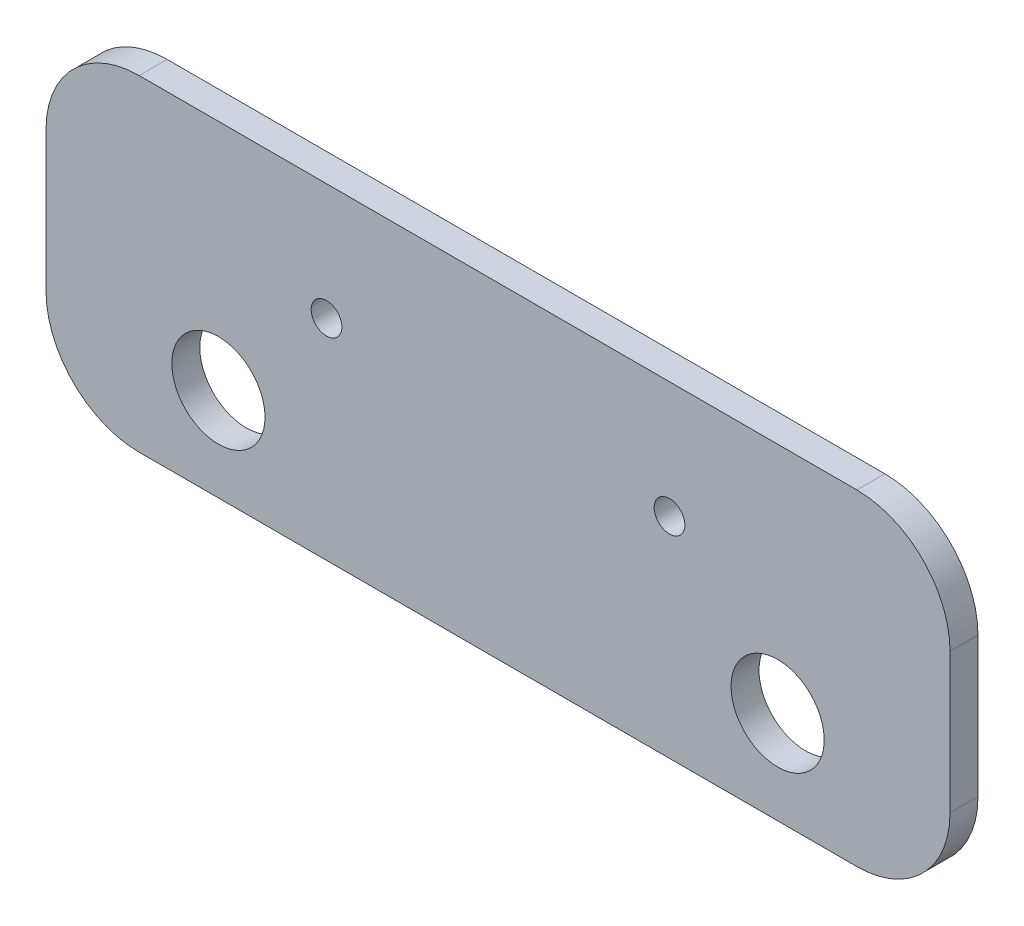
ISO-10303-21;
HEADER;
FILE_DESCRIPTION(('STEP AP214'),'2;1');
FILE_NAME('part.step','',(''),(''),'','','');
FILE_SCHEMA(('AUTOMOTIVE_DESIGN { 1 0 10303 214 1 1 1 1 }'));
ENDSEC;
DATA;
#1=APPLICATION_CONTEXT('core data for automotive mechanical design processes');
#2=APPLICATION_PROTOCOL_DEFINITION('international standard','automotive_design',2000,#1);
#3=PRODUCT_CONTEXT('',#1,'mechanical');
#4=PRODUCT('Part','Part','',(#3));
#5=PRODUCT_RELATED_PRODUCT_CATEGORY('part','',(#4));
#6=PRODUCT_DEFINITION_FORMATION('','',#4);
#7=PRODUCT_DEFINITION_CONTEXT('part definition',#1,'design');
#8=PRODUCT_DEFINITION('design','',#6,#7);
#9=PRODUCT_DEFINITION_SHAPE('','',#8);
#10=(LENGTH_UNIT() NAMED_UNIT(*) SI_UNIT(.MILLI.,.METRE.));
#11=(NAMED_UNIT(*) PLANE_ANGLE_UNIT() SI_UNIT($,.RADIAN.));
#12=(NAMED_UNIT(*) SI_UNIT($,.STERADIAN.) SOLID_ANGLE_UNIT());
#13=UNCERTAINTY_MEASURE_WITH_UNIT(LENGTH_MEASURE(1.E-05),#10,'distance_accuracy_value','');
#14=(GEOMETRIC_REPRESENTATION_CONTEXT(3) GLOBAL_UNCERTAINTY_ASSIGNED_CONTEXT((#13)) GLOBAL_UNIT_ASSIGNED_CONTEXT((#10,
#11,#12)) REPRESENTATION_CONTEXT('',''));
#15=CARTESIAN_POINT('',(0.,0.,0.));
#16=DIRECTION('',(0.,0.,1.));
#17=DIRECTION('',(1.,0.,0.));
#18=AXIS2_PLACEMENT_3D('',#15,#16,#17);
#19=CARTESIAN_POINT('',(0.,0.,3.));
#20=DIRECTION('',(0.,0.,-1.));
#21=DIRECTION('',(-1.,0.,0.));
#22=AXIS2_PLACEMENT_3D('',#19,#20,#21);
#23=PLANE('',#22);
#24=CARTESIAN_POINT('',(-30.,-7.5,3.));
#25=DIRECTION('',(0.,0.,1.));
#26=DIRECTION('',(1.,0.,0.));
#27=AXIS2_PLACEMENT_3D('',#24,#25,#26);
#28=CIRCLE('',#27,5.);
#29=CARTESIAN_POINT('',(-25.,-7.5,3.));
#30=VERTEX_POINT('',#29);
#31=EDGE_CURVE('E193',#30,#30,#28,.T.);
#32=ORIENTED_EDGE('',*,*,#31,.F.);
#33=EDGE_LOOP('',(#32));
#34=FACE_BOUND('',#33,.T.);
#35=CARTESIAN_POINT('',(30.,-7.50000000000005,3.));
#36=DIRECTION('',(0.,0.,-1.));
#37=DIRECTION('',(-1.,0.,0.));
#38=AXIS2_PLACEMENT_3D('',#35,#36,#37);
#39=CIRCLE('',#38,5.);
#40=CARTESIAN_POINT('',(25.,-7.50000000000005,3.));
#41=VERTEX_POINT('',#40);
#42=EDGE_CURVE('E183',#41,#41,#39,.T.);
#43=ORIENTED_EDGE('',*,*,#42,.T.);
#44=EDGE_LOOP('',(#43));
#45=FACE_BOUND('',#44,.T.);
#46=DIRECTION('',(0.,-1.,0.));
#47=VECTOR('',#46,1.);
#48=CARTESIAN_POINT('',(48.5,-17.5,3.));
#49=LINE('',#48,#47);
#50=CARTESIAN_POINT('',(48.5,7.5,3.));
#51=VERTEX_POINT('',#50);
#52=CARTESIAN_POINT('',(48.5,-7.5,3.));
#53=VERTEX_POINT('',#52);
#54=EDGE_CURVE('E210',#51,#53,#49,.T.);
#55=ORIENTED_EDGE('',*,*,#54,.F.);
#56=CARTESIAN_POINT('',(38.5,7.5,3.));
#57=DIRECTION('',(0.,0.,-1.));
#58=DIRECTION('',(-1.,0.,0.));
#59=AXIS2_PLACEMENT_3D('',#56,#57,#58);
#60=CIRCLE('',#59,10.);
#61=CARTESIAN_POINT('',(38.5,17.5,3.));
#62=VERTEX_POINT('',#61);
#63=EDGE_CURVE('E136',#51,#62,#60,.F.);
#64=ORIENTED_EDGE('',*,*,#63,.T.);
#65=DIRECTION('',(-1.,0.,0.));
#66=VECTOR('',#65,1.);
#67=CARTESIAN_POINT('',(-45.5,17.5,3.));
#68=LINE('',#67,#66);
#69=CARTESIAN_POINT('',(-38.5,17.5,3.));
#70=VERTEX_POINT('',#69);
#71=EDGE_CURVE('E214',#62,#70,#68,.T.);
#72=ORIENTED_EDGE('',*,*,#71,.T.);
#73=CARTESIAN_POINT('',(-38.5,7.5,3.));
#74=DIRECTION('',(0.,0.,-1.));
#75=DIRECTION('',(-1.,0.,0.));
#76=AXIS2_PLACEMENT_3D('',#73,#74,#75);
#77=CIRCLE('',#76,10.);
#78=CARTESIAN_POINT('',(-48.5,7.5,3.));
#79=VERTEX_POINT('',#78);
#80=EDGE_CURVE('E142',#70,#79,#77,.F.);
#81=ORIENTED_EDGE('',*,*,#80,.T.);
#82=DIRECTION('',(0.,1.,0.));
#83=VECTOR('',#82,1.);
#84=CARTESIAN_POINT('',(-48.5,17.5,3.));
#85=LINE('',#84,#83);
#86=CARTESIAN_POINT('',(-48.5,-7.5,3.));
#87=VERTEX_POINT('',#86);
#88=EDGE_CURVE('E133',#87,#79,#85,.T.);
#89=ORIENTED_EDGE('',*,*,#88,.F.);
#90=CARTESIAN_POINT('',(-38.5,-7.5,3.));
#91=DIRECTION('',(0.,0.,-1.));
#92=DIRECTION('',(-1.,0.,0.));
#93=AXIS2_PLACEMENT_3D('',#90,#91,#92);
#94=CIRCLE('',#93,10.);
#95=CARTESIAN_POINT('',(-38.5,-17.5,3.));
#96=VERTEX_POINT('',#95);
#97=EDGE_CURVE('E138',#87,#96,#94,.F.);
#98=ORIENTED_EDGE('',*,*,#97,.T.);
#99=DIRECTION('',(1.,0.,0.));
#100=VECTOR('',#99,1.);
#101=CARTESIAN_POINT('',(-45.5,-17.5,3.));
#102=LINE('',#101,#100);
#103=CARTESIAN_POINT('',(38.5,-17.5,3.));
#104=VERTEX_POINT('',#103);
#105=EDGE_CURVE('E144',#96,#104,#102,.T.);
#106=ORIENTED_EDGE('',*,*,#105,.T.);
#107=CARTESIAN_POINT('',(38.5,-7.5,3.));
#108=DIRECTION('',(0.,0.,-1.));
#109=DIRECTION('',(-1.,0.,0.));
#110=AXIS2_PLACEMENT_3D('',#107,#108,#109);
#111=CIRCLE('',#110,10.);
#112=EDGE_CURVE('E150',#104,#53,#111,.F.);
#113=ORIENTED_EDGE('',*,*,#112,.T.);
#114=EDGE_LOOP('',(#55,#64,#72,#81,#89,#98,#106,#113));
#115=FACE_BOUND('',#114,.T.);
#116=CARTESIAN_POINT('',(-18.4,5.00000000000009,3.));
#117=DIRECTION('',(0.,0.,-1.));
#118=DIRECTION('',(-1.,0.,0.));
#119=AXIS2_PLACEMENT_3D('',#116,#117,#118);
#120=CIRCLE('',#119,1.65);
#121=CARTESIAN_POINT('',(-20.05,5.00000000000009,3.));
#122=VERTEX_POINT('',#121);
#123=EDGE_CURVE('E185',#122,#122,#120,.T.);
#124=ORIENTED_EDGE('',*,*,#123,.T.);
#125=EDGE_LOOP('',(#124));
#126=FACE_BOUND('',#125,.T.);
#127=CARTESIAN_POINT('',(18.4,5.00000000000008,3.));
#128=DIRECTION('',(0.,0.,1.));
#129=DIRECTION('',(1.,0.,0.));
#130=AXIS2_PLACEMENT_3D('',#127,#128,#129);
#131=CIRCLE('',#130,1.65);
#132=CARTESIAN_POINT('',(20.05,5.00000000000008,3.));
#133=VERTEX_POINT('',#132);
#134=EDGE_CURVE('E177',#133,#133,#131,.T.);
#135=ORIENTED_EDGE('',*,*,#134,.F.);
#136=EDGE_LOOP('',(#135));
#137=FACE_BOUND('',#136,.T.);
#138=ADVANCED_FACE('F39',(#34,#45,#115,#126,#137),#23,.F.);
#139=CARTESIAN_POINT('',(0.,0.,0.));
#140=DIRECTION('',(0.,0.,-1.));
#141=DIRECTION('',(-1.,0.,0.));
#142=AXIS2_PLACEMENT_3D('',#139,#140,#141);
#143=PLANE('',#142);
#144=CARTESIAN_POINT('',(-18.4,5.00000000000009,0.));
#145=DIRECTION('',(0.,0.,-1.));
#146=DIRECTION('',(-1.,0.,0.));
#147=AXIS2_PLACEMENT_3D('',#144,#145,#146);
#148=CIRCLE('',#147,1.65);
#149=CARTESIAN_POINT('',(-20.05,5.00000000000009,0.));
#150=VERTEX_POINT('',#149);
#151=EDGE_CURVE('E174',#150,#150,#148,.F.);
#152=ORIENTED_EDGE('',*,*,#151,.T.);
#153=EDGE_LOOP('',(#152));
#154=FACE_BOUND('',#153,.T.);
#155=CARTESIAN_POINT('',(30.,-7.50000000000005,0.));
#156=DIRECTION('',(0.,0.,-1.));
#157=DIRECTION('',(-1.,0.,0.));
#158=AXIS2_PLACEMENT_3D('',#155,#156,#157);
#159=CIRCLE('',#158,5.);
#160=CARTESIAN_POINT('',(25.,-7.50000000000005,0.));
#161=VERTEX_POINT('',#160);
#162=EDGE_CURVE('E197',#161,#161,#159,.F.);
#163=ORIENTED_EDGE('',*,*,#162,.T.);
#164=EDGE_LOOP('',(#163));
#165=FACE_BOUND('',#164,.T.);
#166=DIRECTION('',(1.,0.,0.));
#167=VECTOR('',#166,1.);
#168=CARTESIAN_POINT('',(-45.5,17.5,0.));
#169=LINE('',#168,#167);
#170=CARTESIAN_POINT('',(-38.5,17.5,0.));
#171=VERTEX_POINT('',#170);
#172=CARTESIAN_POINT('',(38.5,17.5,0.));
#173=VERTEX_POINT('',#172);
#174=EDGE_CURVE('E115',#171,#173,#169,.T.);
#175=ORIENTED_EDGE('',*,*,#174,.T.);
#176=CARTESIAN_POINT('',(38.5,7.5,0.));
#177=DIRECTION('',(0.,0.,-1.));
#178=DIRECTION('',(-1.,0.,0.));
#179=AXIS2_PLACEMENT_3D('',#176,#177,#178);
#180=CIRCLE('',#179,10.);
#181=CARTESIAN_POINT('',(48.5,7.5,0.));
#182=VERTEX_POINT('',#181);
#183=EDGE_CURVE('E109',#173,#182,#180,.T.);
#184=ORIENTED_EDGE('',*,*,#183,.T.);
#185=DIRECTION('',(0.,-1.,0.));
#186=VECTOR('',#185,1.);
#187=CARTESIAN_POINT('',(48.5,0.,0.));
#188=LINE('',#187,#186);
#189=CARTESIAN_POINT('',(48.5,-7.5,0.));
#190=VERTEX_POINT('',#189);
#191=EDGE_CURVE('E113',#182,#190,#188,.T.);
#192=ORIENTED_EDGE('',*,*,#191,.T.);
#193=CARTESIAN_POINT('',(38.5,-7.5,0.));
#194=DIRECTION('',(0.,0.,-1.));
#195=DIRECTION('',(-1.,0.,0.));
#196=AXIS2_PLACEMENT_3D('',#193,#194,#195);
#197=CIRCLE('',#196,10.);
#198=CARTESIAN_POINT('',(38.5,-17.5,0.));
#199=VERTEX_POINT('',#198);
#200=EDGE_CURVE('E121',#190,#199,#197,.T.);
#201=ORIENTED_EDGE('',*,*,#200,.T.);
#202=DIRECTION('',(1.,0.,0.));
#203=VECTOR('',#202,1.);
#204=CARTESIAN_POINT('',(-45.5,-17.5,0.));
#205=LINE('',#204,#203);
#206=CARTESIAN_POINT('',(-38.5,-17.5,0.));
#207=VERTEX_POINT('',#206);
#208=EDGE_CURVE('E213',#207,#199,#205,.T.);
#209=ORIENTED_EDGE('',*,*,#208,.F.);
#210=CARTESIAN_POINT('',(-38.5,-7.5,0.));
#211=DIRECTION('',(0.,0.,-1.));
#212=DIRECTION('',(-1.,0.,0.));
#213=AXIS2_PLACEMENT_3D('',#210,#211,#212);
#214=CIRCLE('',#213,10.);
#215=CARTESIAN_POINT('',(-48.5,-7.5,0.));
#216=VERTEX_POINT('',#215);
#217=EDGE_CURVE('E57',#207,#216,#214,.T.);
#218=ORIENTED_EDGE('',*,*,#217,.T.);
#219=DIRECTION('',(0.,-1.,0.));
#220=VECTOR('',#219,1.);
#221=CARTESIAN_POINT('',(-48.5,0.,0.));
#222=LINE('',#221,#220);
#223=CARTESIAN_POINT('',(-48.5,7.5,0.));
#224=VERTEX_POINT('',#223);
#225=EDGE_CURVE('E201',#224,#216,#222,.T.);
#226=ORIENTED_EDGE('',*,*,#225,.F.);
#227=CARTESIAN_POINT('',(-38.5,7.5,0.));
#228=DIRECTION('',(0.,0.,-1.));
#229=DIRECTION('',(-1.,0.,0.));
#230=AXIS2_PLACEMENT_3D('',#227,#228,#229);
#231=CIRCLE('',#230,10.);
#232=EDGE_CURVE('E65',#224,#171,#231,.T.);
#233=ORIENTED_EDGE('',*,*,#232,.T.);
#234=EDGE_LOOP('',(#175,#184,#192,#201,#209,#218,#226,#233));
#235=FACE_BOUND('',#234,.T.);
#236=CARTESIAN_POINT('',(-30.,-7.5,0.));
#237=DIRECTION('',(0.,0.,-1.));
#238=DIRECTION('',(-1.,0.,0.));
#239=AXIS2_PLACEMENT_3D('',#236,#237,#238);
#240=CIRCLE('',#239,5.);
#241=CARTESIAN_POINT('',(-35.,-7.5,0.));
#242=VERTEX_POINT('',#241);
#243=EDGE_CURVE('E204',#242,#242,#240,.T.);
#244=ORIENTED_EDGE('',*,*,#243,.F.);
#245=EDGE_LOOP('',(#244));
#246=FACE_BOUND('',#245,.T.);
#247=CARTESIAN_POINT('',(18.4,5.00000000000008,0.));
#248=DIRECTION('',(0.,0.,-1.));
#249=DIRECTION('',(-1.,0.,0.));
#250=AXIS2_PLACEMENT_3D('',#247,#248,#249);
#251=CIRCLE('',#250,1.65);
#252=CARTESIAN_POINT('',(16.75,5.00000000000008,0.));
#253=VERTEX_POINT('',#252);
#254=EDGE_CURVE('E43',#253,#253,#251,.T.);
#255=ORIENTED_EDGE('',*,*,#254,.F.);
#256=EDGE_LOOP('',(#255));
#257=FACE_BOUND('',#256,.T.);
#258=ADVANCED_FACE('F111',(#154,#165,#235,#246,#257),#143,.T.);
#259=CARTESIAN_POINT('',(-45.5,17.5,3.));
#260=DIRECTION('',(0.,-1.,0.));
#261=DIRECTION('',(0.,0.,-1.));
#262=AXIS2_PLACEMENT_3D('',#259,#260,#261);
#263=PLANE('',#262);
#264=ORIENTED_EDGE('',*,*,#71,.F.);
#265=DIRECTION('',(0.,0.,1.));
#266=VECTOR('',#265,1.);
#267=CARTESIAN_POINT('',(38.5,17.5,3.));
#268=LINE('',#267,#266);
#269=EDGE_CURVE('E158',#62,#173,#268,.F.);
#270=ORIENTED_EDGE('',*,*,#269,.T.);
#271=ORIENTED_EDGE('',*,*,#174,.F.);
#272=DIRECTION('',(0.,0.,-1.));
#273=VECTOR('',#272,1.);
#274=CARTESIAN_POINT('',(-38.5,17.5,3.));
#275=LINE('',#274,#273);
#276=EDGE_CURVE('E155',#171,#70,#275,.F.);
#277=ORIENTED_EDGE('',*,*,#276,.T.);
#278=EDGE_LOOP('',(#264,#270,#271,#277));
#279=FACE_BOUND('',#278,.T.);
#280=ADVANCED_FACE('F234',(#279),#263,.F.);
#281=CARTESIAN_POINT('',(-45.5,-17.5,3.));
#282=DIRECTION('',(0.,1.,0.));
#283=DIRECTION('',(0.,0.,1.));
#284=AXIS2_PLACEMENT_3D('',#281,#282,#283);
#285=PLANE('',#284);
#286=ORIENTED_EDGE('',*,*,#208,.T.);
#287=DIRECTION('',(0.,0.,-1.));
#288=VECTOR('',#287,1.);
#289=CARTESIAN_POINT('',(38.5,-17.5,3.));
#290=LINE('',#289,#288);
#291=EDGE_CURVE('E169',#199,#104,#290,.F.);
#292=ORIENTED_EDGE('',*,*,#291,.T.);
#293=ORIENTED_EDGE('',*,*,#105,.F.);
#294=DIRECTION('',(0.,0.,1.));
#295=VECTOR('',#294,1.);
#296=CARTESIAN_POINT('',(-38.5,-17.5,0.));
#297=LINE('',#296,#295);
#298=EDGE_CURVE('E120',#96,#207,#297,.F.);
#299=ORIENTED_EDGE('',*,*,#298,.T.);
#300=EDGE_LOOP('',(#286,#292,#293,#299));
#301=FACE_BOUND('',#300,.T.);
#302=ADVANCED_FACE('F257',(#301),#285,.F.);
#303=CARTESIAN_POINT('',(48.5,0.,0.));
#304=DIRECTION('',(-1.,0.,0.));
#305=DIRECTION('',(0.,0.,1.));
#306=AXIS2_PLACEMENT_3D('',#303,#304,#305);
#307=PLANE('',#306);
#308=ORIENTED_EDGE('',*,*,#191,.F.);
#309=DIRECTION('',(0.,0.,1.));
#310=VECTOR('',#309,1.);
#311=CARTESIAN_POINT('',(48.5,7.5,0.));
#312=LINE('',#311,#310);
#313=EDGE_CURVE('E128',#182,#51,#312,.T.);
#314=ORIENTED_EDGE('',*,*,#313,.T.);
#315=ORIENTED_EDGE('',*,*,#54,.T.);
#316=DIRECTION('',(0.,0.,-1.));
#317=VECTOR('',#316,1.);
#318=CARTESIAN_POINT('',(48.5,-7.5,0.));
#319=LINE('',#318,#317);
#320=EDGE_CURVE('E131',#53,#190,#319,.T.);
#321=ORIENTED_EDGE('',*,*,#320,.T.);
#322=EDGE_LOOP('',(#308,#314,#315,#321));
#323=FACE_BOUND('',#322,.T.);
#324=ADVANCED_FACE('F126',(#323),#307,.F.);
#325=CARTESIAN_POINT('',(-48.5,0.,0.));
#326=DIRECTION('',(-1.,0.,0.));
#327=DIRECTION('',(0.,0.,1.));
#328=AXIS2_PLACEMENT_3D('',#325,#326,#327);
#329=PLANE('',#328);
#330=ORIENTED_EDGE('',*,*,#88,.T.);
#331=DIRECTION('',(0.,0.,-1.));
#332=VECTOR('',#331,1.);
#333=CARTESIAN_POINT('',(-48.5,7.5,0.));
#334=LINE('',#333,#332);
#335=EDGE_CURVE('E11',#79,#224,#334,.T.);
#336=ORIENTED_EDGE('',*,*,#335,.T.);
#337=ORIENTED_EDGE('',*,*,#225,.T.);
#338=DIRECTION('',(0.,0.,1.));
#339=VECTOR('',#338,1.);
#340=CARTESIAN_POINT('',(-48.5,-7.5,3.));
#341=LINE('',#340,#339);
#342=EDGE_CURVE('E49',#216,#87,#341,.T.);
#343=ORIENTED_EDGE('',*,*,#342,.T.);
#344=EDGE_LOOP('',(#330,#336,#337,#343));
#345=FACE_BOUND('',#344,.T.);
#346=ADVANCED_FACE('F281',(#345),#329,.T.);
#347=CARTESIAN_POINT('',(30.,-7.50000000000005,-54.6696284208986));
#348=DIRECTION('',(0.,0.,1.));
#349=DIRECTION('',(1.,0.,0.));
#350=AXIS2_PLACEMENT_3D('',#347,#348,#349);
#351=CYLINDRICAL_SURFACE('',#350,5.);
#352=ORIENTED_EDGE('',*,*,#162,.F.);
#353=EDGE_LOOP('',(#352));
#354=FACE_BOUND('',#353,.T.);
#355=ORIENTED_EDGE('',*,*,#42,.F.);
#356=EDGE_LOOP('',(#355));
#357=FACE_BOUND('',#356,.T.);
#358=ADVANCED_FACE('F288',(#354,#357),#351,.F.);
#359=CARTESIAN_POINT('',(-30.,-7.5,-54.6696284208986));
#360=DIRECTION('',(0.,0.,1.));
#361=DIRECTION('',(1.,0.,0.));
#362=AXIS2_PLACEMENT_3D('',#359,#360,#361);
#363=CYLINDRICAL_SURFACE('',#362,5.);
#364=ORIENTED_EDGE('',*,*,#243,.T.);
#365=EDGE_LOOP('',(#364));
#366=FACE_BOUND('',#365,.T.);
#367=ORIENTED_EDGE('',*,*,#31,.T.);
#368=EDGE_LOOP('',(#367));
#369=FACE_BOUND('',#368,.T.);
#370=ADVANCED_FACE('F230',(#366,#369),#363,.F.);
#371=CARTESIAN_POINT('',(38.5,7.5,0.));
#372=DIRECTION('',(0.,0.,1.));
#373=DIRECTION('',(1.,0.,0.));
#374=AXIS2_PLACEMENT_3D('',#371,#372,#373);
#375=CYLINDRICAL_SURFACE('',#374,10.);
#376=ORIENTED_EDGE('',*,*,#183,.F.);
#377=ORIENTED_EDGE('',*,*,#269,.F.);
#378=ORIENTED_EDGE('',*,*,#63,.F.);
#379=ORIENTED_EDGE('',*,*,#313,.F.);
#380=EDGE_LOOP('',(#376,#377,#378,#379));
#381=FACE_BOUND('',#380,.T.);
#382=ADVANCED_FACE('F135',(#381),#375,.T.);
#383=CARTESIAN_POINT('',(38.5,-7.5,0.));
#384=DIRECTION('',(0.,0.,-1.));
#385=DIRECTION('',(-1.,0.,0.));
#386=AXIS2_PLACEMENT_3D('',#383,#384,#385);
#387=CYLINDRICAL_SURFACE('',#386,10.);
#388=ORIENTED_EDGE('',*,*,#112,.F.);
#389=ORIENTED_EDGE('',*,*,#291,.F.);
#390=ORIENTED_EDGE('',*,*,#200,.F.);
#391=ORIENTED_EDGE('',*,*,#320,.F.);
#392=EDGE_LOOP('',(#388,#389,#390,#391));
#393=FACE_BOUND('',#392,.T.);
#394=ADVANCED_FACE('F266',(#393),#387,.T.);
#395=CARTESIAN_POINT('',(-38.5,7.5,0.));
#396=DIRECTION('',(0.,0.,1.));
#397=DIRECTION('',(1.,0.,0.));
#398=AXIS2_PLACEMENT_3D('',#395,#396,#397);
#399=CYLINDRICAL_SURFACE('',#398,10.);
#400=ORIENTED_EDGE('',*,*,#80,.F.);
#401=ORIENTED_EDGE('',*,*,#276,.F.);
#402=ORIENTED_EDGE('',*,*,#232,.F.);
#403=ORIENTED_EDGE('',*,*,#335,.F.);
#404=EDGE_LOOP('',(#400,#401,#402,#403));
#405=FACE_BOUND('',#404,.T.);
#406=ADVANCED_FACE('F268',(#405),#399,.T.);
#407=CARTESIAN_POINT('',(-38.5,-7.5,0.));
#408=DIRECTION('',(0.,0.,-1.));
#409=DIRECTION('',(-1.,0.,0.));
#410=AXIS2_PLACEMENT_3D('',#407,#408,#409);
#411=CYLINDRICAL_SURFACE('',#410,10.);
#412=ORIENTED_EDGE('',*,*,#217,.F.);
#413=ORIENTED_EDGE('',*,*,#298,.F.);
#414=ORIENTED_EDGE('',*,*,#97,.F.);
#415=ORIENTED_EDGE('',*,*,#342,.F.);
#416=EDGE_LOOP('',(#412,#413,#414,#415));
#417=FACE_BOUND('',#416,.T.);
#418=ADVANCED_FACE('F41',(#417),#411,.T.);
#419=CARTESIAN_POINT('',(-18.4,5.00000000000009,-7.));
#420=DIRECTION('',(0.,0.,1.));
#421=DIRECTION('',(1.,0.,0.));
#422=AXIS2_PLACEMENT_3D('',#419,#420,#421);
#423=CYLINDRICAL_SURFACE('',#422,1.65);
#424=ORIENTED_EDGE('',*,*,#151,.F.);
#425=EDGE_LOOP('',(#424));
#426=FACE_BOUND('',#425,.T.);
#427=ORIENTED_EDGE('',*,*,#123,.F.);
#428=EDGE_LOOP('',(#427));
#429=FACE_BOUND('',#428,.T.);
#430=ADVANCED_FACE('F240',(#426,#429),#423,.F.);
#431=CARTESIAN_POINT('',(18.4,5.00000000000008,-7.));
#432=DIRECTION('',(0.,0.,1.));
#433=DIRECTION('',(1.,0.,0.));
#434=AXIS2_PLACEMENT_3D('',#431,#432,#433);
#435=CYLINDRICAL_SURFACE('',#434,1.65);
#436=ORIENTED_EDGE('',*,*,#254,.T.);
#437=EDGE_LOOP('',(#436));
#438=FACE_BOUND('',#437,.T.);
#439=ORIENTED_EDGE('',*,*,#134,.T.);
#440=EDGE_LOOP('',(#439));
#441=FACE_BOUND('',#440,.T.);
#442=ADVANCED_FACE('F238',(#438,#441),#435,.F.);
#443=CLOSED_SHELL('',(#138,#258,#280,#302,#324,#346,#358,#370,#382,#394,#406,#418,#430,#442));
#444=MANIFOLD_SOLID_BREP('B2',#443);
#445=ADVANCED_BREP_SHAPE_REPRESENTATION('',(#18,#444),#14);
#446=SHAPE_DEFINITION_REPRESENTATION(#9,#445);
ENDSEC;
END-ISO-10303-21;
